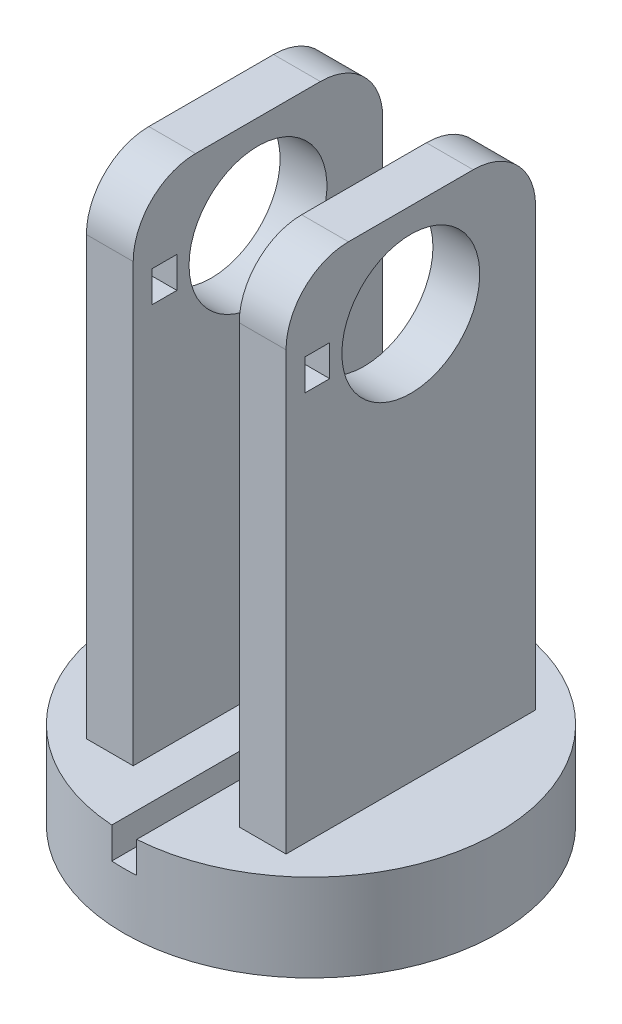
ISO-10303-21;
HEADER;
FILE_DESCRIPTION(('STEP AP214'),'2;1');
FILE_NAME('part.step','',(''),(''),'','','');
FILE_SCHEMA(('AUTOMOTIVE_DESIGN { 1 0 10303 214 1 1 1 1 }'));
ENDSEC;
DATA;
#1=APPLICATION_CONTEXT('core data for automotive mechanical design processes');
#2=APPLICATION_PROTOCOL_DEFINITION('international standard','automotive_design',2000,#1);
#3=PRODUCT_CONTEXT('',#1,'mechanical');
#4=PRODUCT('Part','Part','',(#3));
#5=PRODUCT_RELATED_PRODUCT_CATEGORY('part','',(#4));
#6=PRODUCT_DEFINITION_FORMATION('','',#4);
#7=PRODUCT_DEFINITION_CONTEXT('part definition',#1,'design');
#8=PRODUCT_DEFINITION('design','',#6,#7);
#9=PRODUCT_DEFINITION_SHAPE('','',#8);
#10=(LENGTH_UNIT() NAMED_UNIT(*) SI_UNIT(.MILLI.,.METRE.));
#11=(NAMED_UNIT(*) PLANE_ANGLE_UNIT() SI_UNIT($,.RADIAN.));
#12=(NAMED_UNIT(*) SI_UNIT($,.STERADIAN.) SOLID_ANGLE_UNIT());
#13=UNCERTAINTY_MEASURE_WITH_UNIT(LENGTH_MEASURE(1.E-05),#10,'distance_accuracy_value','');
#14=(GEOMETRIC_REPRESENTATION_CONTEXT(3) GLOBAL_UNCERTAINTY_ASSIGNED_CONTEXT((#13)) GLOBAL_UNIT_ASSIGNED_CONTEXT((#10,
#11,#12)) REPRESENTATION_CONTEXT('',''));
#15=CARTESIAN_POINT('',(0.,0.,0.));
#16=DIRECTION('',(0.,0.,1.));
#17=DIRECTION('',(1.,0.,0.));
#18=AXIS2_PLACEMENT_3D('',#15,#16,#17);
#19=CARTESIAN_POINT('',(0.,14.,0.));
#20=DIRECTION('',(0.,1.,0.));
#21=DIRECTION('',(0.,0.,1.));
#22=AXIS2_PLACEMENT_3D('',#19,#20,#21);
#23=PLANE('',#22);
#24=DIRECTION('',(0.,0.,-1.));
#25=VECTOR('',#24,1.);
#26=CARTESIAN_POINT('',(2.,14.,-29.9332590941915));
#27=LINE('',#26,#25);
#28=CARTESIAN_POINT('',(2.,14.,29.9332590941915));
#29=VERTEX_POINT('',#28);
#30=CARTESIAN_POINT('',(2.,14.,-29.9332590941915));
#31=VERTEX_POINT('',#30);
#32=EDGE_CURVE('E245',#29,#31,#27,.T.);
#33=ORIENTED_EDGE('',*,*,#32,.F.);
#34=CARTESIAN_POINT('',(0.,14.,0.));
#35=DIRECTION('',(0.,1.,0.));
#36=DIRECTION('',(0.,0.,1.));
#37=AXIS2_PLACEMENT_3D('',#34,#35,#36);
#38=CIRCLE('',#37,30.);
#39=EDGE_CURVE('E333',#29,#31,#38,.T.);
#40=ORIENTED_EDGE('',*,*,#39,.T.);
#41=EDGE_LOOP('',(#33,#40));
#42=FACE_BOUND('',#41,.T.);
#43=DIRECTION('',(0.,0.,-1.));
#44=VECTOR('',#43,1.);
#45=CARTESIAN_POINT('',(16.,14.,20.));
#46=LINE('',#45,#44);
#47=CARTESIAN_POINT('',(16.,14.,20.));
#48=VERTEX_POINT('',#47);
#49=CARTESIAN_POINT('',(16.,14.,-20.));
#50=VERTEX_POINT('',#49);
#51=EDGE_CURVE('E285',#48,#50,#46,.T.);
#52=ORIENTED_EDGE('',*,*,#51,.F.);
#53=DIRECTION('',(1.,0.,0.));
#54=VECTOR('',#53,1.);
#55=CARTESIAN_POINT('',(8.5,14.,20.));
#56=LINE('',#55,#54);
#57=CARTESIAN_POINT('',(8.5,14.,20.));
#58=VERTEX_POINT('',#57);
#59=EDGE_CURVE('E274',#58,#48,#56,.T.);
#60=ORIENTED_EDGE('',*,*,#59,.F.);
#61=DIRECTION('',(0.,0.,1.));
#62=VECTOR('',#61,1.);
#63=CARTESIAN_POINT('',(8.5,14.,-20.));
#64=LINE('',#63,#62);
#65=CARTESIAN_POINT('',(8.5,14.,-20.));
#66=VERTEX_POINT('',#65);
#67=EDGE_CURVE('E279',#66,#58,#64,.T.);
#68=ORIENTED_EDGE('',*,*,#67,.F.);
#69=DIRECTION('',(-1.,0.,0.));
#70=VECTOR('',#69,1.);
#71=CARTESIAN_POINT('',(16.,14.,-20.));
#72=LINE('',#71,#70);
#73=EDGE_CURVE('E288',#50,#66,#72,.T.);
#74=ORIENTED_EDGE('',*,*,#73,.F.);
#75=EDGE_LOOP('',(#52,#60,#68,#74));
#76=FACE_BOUND('',#75,.T.);
#77=ADVANCED_FACE('F32',(#42,#76),#23,.T.);
#78=DIRECTION('',(0.,0.,1.));
#79=VECTOR('',#78,1.);
#80=CARTESIAN_POINT('',(-2.,14.,-29.9332590941915));
#81=LINE('',#80,#79);
#82=CARTESIAN_POINT('',(-2.,14.,-29.9332590941915));
#83=VERTEX_POINT('',#82);
#84=CARTESIAN_POINT('',(-2.,14.,29.9332590941915));
#85=VERTEX_POINT('',#84);
#86=EDGE_CURVE('E240',#83,#85,#81,.T.);
#87=ORIENTED_EDGE('',*,*,#86,.F.);
#88=EDGE_CURVE('E337',#83,#85,#38,.T.);
#89=ORIENTED_EDGE('',*,*,#88,.T.);
#90=EDGE_LOOP('',(#87,#89));
#91=FACE_BOUND('',#90,.T.);
#92=DIRECTION('',(0.,0.,-1.));
#93=VECTOR('',#92,1.);
#94=CARTESIAN_POINT('',(-8.5,14.,20.));
#95=LINE('',#94,#93);
#96=CARTESIAN_POINT('',(-8.5,14.,20.));
#97=VERTEX_POINT('',#96);
#98=CARTESIAN_POINT('',(-8.5,14.,-20.));
#99=VERTEX_POINT('',#98);
#100=EDGE_CURVE('E311',#97,#99,#95,.T.);
#101=ORIENTED_EDGE('',*,*,#100,.F.);
#102=DIRECTION('',(1.,0.,0.));
#103=VECTOR('',#102,1.);
#104=CARTESIAN_POINT('',(-16.,14.,20.));
#105=LINE('',#104,#103);
#106=CARTESIAN_POINT('',(-16.,14.,20.));
#107=VERTEX_POINT('',#106);
#108=EDGE_CURVE('E300',#107,#97,#105,.T.);
#109=ORIENTED_EDGE('',*,*,#108,.F.);
#110=DIRECTION('',(0.,0.,1.));
#111=VECTOR('',#110,1.);
#112=CARTESIAN_POINT('',(-16.,14.,-20.));
#113=LINE('',#112,#111);
#114=CARTESIAN_POINT('',(-16.,14.,-20.));
#115=VERTEX_POINT('',#114);
#116=EDGE_CURVE('E305',#115,#107,#113,.T.);
#117=ORIENTED_EDGE('',*,*,#116,.F.);
#118=DIRECTION('',(-1.,0.,0.));
#119=VECTOR('',#118,1.);
#120=CARTESIAN_POINT('',(-8.5,14.,-20.));
#121=LINE('',#120,#119);
#122=EDGE_CURVE('E314',#99,#115,#121,.T.);
#123=ORIENTED_EDGE('',*,*,#122,.F.);
#124=EDGE_LOOP('',(#101,#109,#117,#123));
#125=FACE_BOUND('',#124,.T.);
#126=ADVANCED_FACE('F449',(#91,#125),#23,.T.);
#127=CARTESIAN_POINT('',(0.,14.,0.));
#128=DIRECTION('',(0.,-1.,0.));
#129=DIRECTION('',(0.,0.,-1.));
#130=AXIS2_PLACEMENT_3D('',#127,#128,#129);
#131=CYLINDRICAL_SURFACE('',#130,30.);
#132=CARTESIAN_POINT('',(0.,9.,0.));
#133=DIRECTION('',(0.,1.,0.));
#134=DIRECTION('',(0.,0.,1.));
#135=AXIS2_PLACEMENT_3D('',#132,#133,#134);
#136=CIRCLE('',#135,30.);
#137=CARTESIAN_POINT('',(2.,9.,-29.9332590941915));
#138=VERTEX_POINT('',#137);
#139=CARTESIAN_POINT('',(-2.,9.,-29.9332590941915));
#140=VERTEX_POINT('',#139);
#141=EDGE_CURVE('E241',#138,#140,#136,.T.);
#142=ORIENTED_EDGE('',*,*,#141,.F.);
#143=DIRECTION('',(0.,1.,0.));
#144=VECTOR('',#143,1.);
#145=CARTESIAN_POINT('',(2.,9.,-29.9332590941915));
#146=LINE('',#145,#144);
#147=EDGE_CURVE('E255',#138,#31,#146,.T.);
#148=ORIENTED_EDGE('',*,*,#147,.T.);
#149=ORIENTED_EDGE('',*,*,#39,.F.);
#150=DIRECTION('',(0.,1.,0.));
#151=VECTOR('',#150,1.);
#152=CARTESIAN_POINT('',(2.,9.,29.9332590941915));
#153=LINE('',#152,#151);
#154=CARTESIAN_POINT('',(2.,9.,29.9332590941915));
#155=VERTEX_POINT('',#154);
#156=EDGE_CURVE('E259',#155,#29,#153,.T.);
#157=ORIENTED_EDGE('',*,*,#156,.F.);
#158=CARTESIAN_POINT('',(0.,9.,0.));
#159=DIRECTION('',(0.,1.,0.));
#160=DIRECTION('',(0.,0.,1.));
#161=AXIS2_PLACEMENT_3D('',#158,#159,#160);
#162=CIRCLE('',#161,30.);
#163=CARTESIAN_POINT('',(-2.,9.,29.9332590941915));
#164=VERTEX_POINT('',#163);
#165=EDGE_CURVE('E247',#164,#155,#162,.T.);
#166=ORIENTED_EDGE('',*,*,#165,.F.);
#167=DIRECTION('',(0.,1.,0.));
#168=VECTOR('',#167,1.);
#169=CARTESIAN_POINT('',(-2.,9.,29.9332590941915));
#170=LINE('',#169,#168);
#171=EDGE_CURVE('E261',#164,#85,#170,.T.);
#172=ORIENTED_EDGE('',*,*,#171,.T.);
#173=ORIENTED_EDGE('',*,*,#88,.F.);
#174=DIRECTION('',(0.,1.,0.));
#175=VECTOR('',#174,1.);
#176=CARTESIAN_POINT('',(-2.,9.,-29.9332590941915));
#177=LINE('',#176,#175);
#178=EDGE_CURVE('E252',#140,#83,#177,.T.);
#179=ORIENTED_EDGE('',*,*,#178,.F.);
#180=EDGE_LOOP('',(#142,#148,#149,#157,#166,#172,#173,#179));
#181=FACE_BOUND('',#180,.T.);
#182=CARTESIAN_POINT('',(0.,0.,0.));
#183=DIRECTION('',(0.,1.,0.));
#184=DIRECTION('',(0.,0.,1.));
#185=AXIS2_PLACEMENT_3D('',#182,#183,#184);
#186=CIRCLE('',#185,30.);
#187=CARTESIAN_POINT('',(0.,0.,30.));
#188=VERTEX_POINT('',#187);
#189=EDGE_CURVE('E330',#188,#188,#186,.T.);
#190=ORIENTED_EDGE('',*,*,#189,.T.);
#191=EDGE_LOOP('',(#190));
#192=FACE_BOUND('',#191,.T.);
#193=ADVANCED_FACE('F455',(#181,#192),#131,.T.);
#194=CARTESIAN_POINT('',(0.,0.,0.));
#195=DIRECTION('',(0.,1.,0.));
#196=DIRECTION('',(0.,0.,1.));
#197=AXIS2_PLACEMENT_3D('',#194,#195,#196);
#198=PLANE('',#197);
#199=CARTESIAN_POINT('',(0.,0.,0.));
#200=DIRECTION('',(0.,-1.,0.));
#201=DIRECTION('',(0.,0.,-1.));
#202=AXIS2_PLACEMENT_3D('',#199,#200,#201);
#203=CIRCLE('',#202,11.05);
#204=CARTESIAN_POINT('',(0.,0.,-11.05));
#205=VERTEX_POINT('',#204);
#206=EDGE_CURVE('E326',#205,#205,#203,.T.);
#207=ORIENTED_EDGE('',*,*,#206,.F.);
#208=EDGE_LOOP('',(#207));
#209=FACE_BOUND('',#208,.T.);
#210=ORIENTED_EDGE('',*,*,#189,.F.);
#211=EDGE_LOOP('',(#210));
#212=FACE_BOUND('',#211,.T.);
#213=ADVANCED_FACE('F462',(#209,#212),#198,.F.);
#214=CARTESIAN_POINT('',(0.,7.,0.));
#215=DIRECTION('',(0.,-1.,0.));
#216=DIRECTION('',(0.,0.,-1.));
#217=AXIS2_PLACEMENT_3D('',#214,#215,#216);
#218=CYLINDRICAL_SURFACE('',#217,11.05);
#219=CARTESIAN_POINT('',(0.,7.,0.));
#220=DIRECTION('',(0.,-1.,0.));
#221=DIRECTION('',(0.,0.,-1.));
#222=AXIS2_PLACEMENT_3D('',#219,#220,#221);
#223=CIRCLE('',#222,11.05);
#224=CARTESIAN_POINT('',(0.,7.,-11.05));
#225=VERTEX_POINT('',#224);
#226=EDGE_CURVE('E327',#225,#225,#223,.T.);
#227=CARTESIAN_POINT('',(0.,7.,-11.05));
#228=CARTESIAN_POINT('',(0.,6.92708333333333,-11.05));
#229=CARTESIAN_POINT('',(0.,6.85416666666667,-11.05));
#230=CARTESIAN_POINT('',(0.,6.70833333333333,-11.05));
#231=CARTESIAN_POINT('',(0.,6.63541666666667,-11.05));
#232=CARTESIAN_POINT('',(0.,6.48958333333333,-11.05));
#233=CARTESIAN_POINT('',(0.,6.41666666666667,-11.05));
#234=CARTESIAN_POINT('',(0.,6.27083333333333,-11.05));
#235=CARTESIAN_POINT('',(0.,6.19791666666667,-11.05));
#236=CARTESIAN_POINT('',(0.,6.05208333333333,-11.05));
#237=CARTESIAN_POINT('',(0.,5.97916666666667,-11.05));
#238=CARTESIAN_POINT('',(0.,5.83333333333333,-11.05));
#239=CARTESIAN_POINT('',(0.,5.76041666666667,-11.05));
#240=CARTESIAN_POINT('',(0.,5.61458333333333,-11.05));
#241=CARTESIAN_POINT('',(0.,5.54166666666667,-11.05));
#242=CARTESIAN_POINT('',(0.,5.39583333333333,-11.05));
#243=CARTESIAN_POINT('',(0.,5.32291666666667,-11.05));
#244=CARTESIAN_POINT('',(0.,5.17708333333333,-11.05));
#245=CARTESIAN_POINT('',(0.,5.10416666666667,-11.05));
#246=CARTESIAN_POINT('',(0.,4.95833333333333,-11.05));
#247=CARTESIAN_POINT('',(0.,4.88541666666667,-11.05));
#248=CARTESIAN_POINT('',(0.,4.73958333333333,-11.05));
#249=CARTESIAN_POINT('',(0.,4.66666666666667,-11.05));
#250=CARTESIAN_POINT('',(0.,4.52083333333333,-11.05));
#251=CARTESIAN_POINT('',(0.,4.44791666666667,-11.05));
#252=CARTESIAN_POINT('',(0.,4.30208333333333,-11.05));
#253=CARTESIAN_POINT('',(0.,4.22916666666667,-11.05));
#254=CARTESIAN_POINT('',(0.,4.08333333333333,-11.05));
#255=CARTESIAN_POINT('',(0.,4.01041666666667,-11.05));
#256=CARTESIAN_POINT('',(0.,3.86458333333333,-11.05));
#257=CARTESIAN_POINT('',(0.,3.79166666666667,-11.05));
#258=CARTESIAN_POINT('',(0.,3.64583333333333,-11.05));
#259=CARTESIAN_POINT('',(0.,3.57291666666667,-11.05));
#260=CARTESIAN_POINT('',(0.,3.42708333333333,-11.05));
#261=CARTESIAN_POINT('',(0.,3.35416666666667,-11.05));
#262=CARTESIAN_POINT('',(0.,3.20833333333333,-11.05));
#263=CARTESIAN_POINT('',(0.,3.13541666666667,-11.05));
#264=CARTESIAN_POINT('',(0.,2.98958333333333,-11.05));
#265=CARTESIAN_POINT('',(0.,2.91666666666667,-11.05));
#266=CARTESIAN_POINT('',(0.,2.77083333333333,-11.05));
#267=CARTESIAN_POINT('',(0.,2.69791666666667,-11.05));
#268=CARTESIAN_POINT('',(0.,2.55208333333333,-11.05));
#269=CARTESIAN_POINT('',(0.,2.47916666666667,-11.05));
#270=CARTESIAN_POINT('',(0.,2.33333333333333,-11.05));
#271=CARTESIAN_POINT('',(0.,2.26041666666667,-11.05));
#272=CARTESIAN_POINT('',(0.,2.11458333333333,-11.05));
#273=CARTESIAN_POINT('',(0.,2.04166666666667,-11.05));
#274=CARTESIAN_POINT('',(0.,1.89583333333333,-11.05));
#275=CARTESIAN_POINT('',(0.,1.82291666666667,-11.05));
#276=CARTESIAN_POINT('',(0.,1.67708333333333,-11.05));
#277=CARTESIAN_POINT('',(0.,1.60416666666667,-11.05));
#278=CARTESIAN_POINT('',(0.,1.45833333333333,-11.05));
#279=CARTESIAN_POINT('',(0.,1.38541666666667,-11.05));
#280=CARTESIAN_POINT('',(0.,1.23958333333333,-11.05));
#281=CARTESIAN_POINT('',(0.,1.16666666666667,-11.05));
#282=CARTESIAN_POINT('',(0.,1.02083333333333,-11.05));
#283=CARTESIAN_POINT('',(0.,0.947916666666668,-11.05));
#284=CARTESIAN_POINT('',(0.,0.802083333333334,-11.05));
#285=CARTESIAN_POINT('',(0.,0.729166666666667,-11.05));
#286=CARTESIAN_POINT('',(0.,0.583333333333334,-11.05));
#287=CARTESIAN_POINT('',(0.,0.510416666666668,-11.05));
#288=CARTESIAN_POINT('',(0.,0.364583333333335,-11.05));
#289=CARTESIAN_POINT('',(0.,0.291666666666668,-11.05));
#290=CARTESIAN_POINT('',(0.,0.145833333333334,-11.05));
#291=CARTESIAN_POINT('',(0.,0.0729166666666675,-11.05));
#292=CARTESIAN_POINT('',(0.,0.,-11.05));
#293=B_SPLINE_CURVE_WITH_KNOTS('',3,(#227,#228,#229,#230,#231,#232,#233,#234,#235,#236,#237,
#238,#239,#240,#241,#242,#243,#244,#245,#246,#247,#248,#249,#250,#251,#252,#253,#254,#255,#256,
#257,#258,#259,#260,#261,#262,#263,#264,#265,#266,#267,#268,#269,#270,#271,#272,#273,#274,#275,
#276,#277,#278,#279,#280,#281,#282,#283,#284,#285,#286,#287,#288,#289,#290,#291,#292),
.UNSPECIFIED.,.F.,.F.,(4,2,2,2,2,2,2,2,2,2,2,2,2,2,2,2,2,2,2,2,2,2,2,2,2,2,2,2,2,2,2,2,4),(0.,
0.21875,0.4375,0.656250000000001,0.875,1.09375,1.3125,1.53125,1.75,1.96875,2.1875,2.40625,2.625,
2.84375,3.0625,3.28125,3.5,3.71875,3.9375,4.15625,4.375,4.59375,4.8125,5.03125,5.25,5.46875,
5.6875,5.90625,6.125,6.34375,6.5625,6.78125,7.),.UNSPECIFIED.);
#294=EDGE_CURVE('BSEAM460',#225,#205,#293,.T.);
#295=ORIENTED_EDGE('',*,*,#226,.F.);
#296=ORIENTED_EDGE('',*,*,#206,.T.);
#297=ORIENTED_EDGE('',*,*,#294,.T.);
#298=ORIENTED_EDGE('',*,*,#294,.F.);
#299=EDGE_LOOP('',(#295,#297,#296,#298));
#300=FACE_BOUND('',#299,.T.);
#301=ADVANCED_FACE('F460',(#300),#218,.F.);
#302=CARTESIAN_POINT('',(0.,7.,0.));
#303=DIRECTION('',(0.,-1.,0.));
#304=DIRECTION('',(0.,0.,-1.));
#305=AXIS2_PLACEMENT_3D('',#302,#303,#304);
#306=PLANE('',#305);
#307=ORIENTED_EDGE('',*,*,#226,.T.);
#308=EDGE_LOOP('',(#307));
#309=FACE_BOUND('',#308,.T.);
#310=ADVANCED_FACE('F520',(#309),#306,.T.);
#311=CARTESIAN_POINT('',(-16.,94.,20.));
#312=DIRECTION('',(0.,0.,-1.));
#313=DIRECTION('',(-1.,0.,0.));
#314=AXIS2_PLACEMENT_3D('',#311,#312,#313);
#315=PLANE('',#314);
#316=DIRECTION('',(0.,-1.,0.));
#317=VECTOR('',#316,1.);
#318=CARTESIAN_POINT('',(-8.5,94.,20.));
#319=LINE('',#318,#317);
#320=CARTESIAN_POINT('',(-8.5,84.,20.));
#321=VERTEX_POINT('',#320);
#322=EDGE_CURVE('E324',#321,#97,#319,.T.);
#323=ORIENTED_EDGE('',*,*,#322,.F.);
#324=DIRECTION('',(1.,0.,0.));
#325=VECTOR('',#324,1.);
#326=CARTESIAN_POINT('',(-16.,84.,20.));
#327=LINE('',#326,#325);
#328=CARTESIAN_POINT('',(-16.,84.,20.));
#329=VERTEX_POINT('',#328);
#330=EDGE_CURVE('E373',#321,#329,#327,.F.);
#331=ORIENTED_EDGE('',*,*,#330,.T.);
#332=DIRECTION('',(0.,-1.,0.));
#333=VECTOR('',#332,1.);
#334=CARTESIAN_POINT('',(-16.,94.,20.));
#335=LINE('',#334,#333);
#336=EDGE_CURVE('E308',#329,#107,#335,.T.);
#337=ORIENTED_EDGE('',*,*,#336,.T.);
#338=ORIENTED_EDGE('',*,*,#108,.T.);
#339=EDGE_LOOP('',(#323,#331,#337,#338));
#340=FACE_BOUND('',#339,.T.);
#341=ADVANCED_FACE('F509',(#340),#315,.F.);
#342=CARTESIAN_POINT('',(-8.5,94.,20.));
#343=DIRECTION('',(-1.,0.,0.));
#344=DIRECTION('',(0.,0.,1.));
#345=AXIS2_PLACEMENT_3D('',#342,#343,#344);
#346=PLANE('',#345);
#347=DIRECTION('',(0.,0.,-1.));
#348=VECTOR('',#347,1.);
#349=CARTESIAN_POINT('',(-8.5,76.5,20.));
#350=LINE('',#349,#348);
#351=CARTESIAN_POINT('',(-8.5,76.5,17.));
#352=VERTEX_POINT('',#351);
#353=CARTESIAN_POINT('',(-8.5,76.5,13.));
#354=VERTEX_POINT('',#353);
#355=EDGE_CURVE('E235',#352,#354,#350,.T.);
#356=ORIENTED_EDGE('',*,*,#355,.F.);
#357=DIRECTION('',(0.,1.,0.));
#358=VECTOR('',#357,1.);
#359=CARTESIAN_POINT('',(-8.5,94.,17.));
#360=LINE('',#359,#358);
#361=CARTESIAN_POINT('',(-8.5,81.5,17.));
#362=VERTEX_POINT('',#361);
#363=EDGE_CURVE('E237',#352,#362,#360,.T.);
#364=ORIENTED_EDGE('',*,*,#363,.T.);
#365=DIRECTION('',(0.,0.,-1.));
#366=VECTOR('',#365,1.);
#367=CARTESIAN_POINT('',(-8.5,81.5,20.));
#368=LINE('',#367,#366);
#369=CARTESIAN_POINT('',(-8.5,81.5,13.));
#370=VERTEX_POINT('',#369);
#371=EDGE_CURVE('E231',#362,#370,#368,.T.);
#372=ORIENTED_EDGE('',*,*,#371,.T.);
#373=DIRECTION('',(0.,1.,0.));
#374=VECTOR('',#373,1.);
#375=CARTESIAN_POINT('',(-8.5,94.,13.));
#376=LINE('',#375,#374);
#377=EDGE_CURVE('E199',#354,#370,#376,.T.);
#378=ORIENTED_EDGE('',*,*,#377,.F.);
#379=EDGE_LOOP('',(#356,#364,#372,#378));
#380=FACE_BOUND('',#379,.T.);
#381=CARTESIAN_POINT('',(-8.5,79.,0.));
#382=DIRECTION('',(-1.,0.,0.));
#383=DIRECTION('',(0.,0.,1.));
#384=AXIS2_PLACEMENT_3D('',#381,#382,#383);
#385=CIRCLE('',#384,11.05);
#386=CARTESIAN_POINT('',(-8.5,79.,11.05));
#387=VERTEX_POINT('',#386);
#388=EDGE_CURVE('E271',#387,#387,#385,.T.);
#389=ORIENTED_EDGE('',*,*,#388,.T.);
#390=EDGE_LOOP('',(#389));
#391=FACE_BOUND('',#390,.T.);
#392=DIRECTION('',(0.,-1.,0.));
#393=VECTOR('',#392,1.);
#394=CARTESIAN_POINT('',(-8.5,94.,-20.));
#395=LINE('',#394,#393);
#396=CARTESIAN_POINT('',(-8.5,84.,-20.));
#397=VERTEX_POINT('',#396);
#398=EDGE_CURVE('E322',#397,#99,#395,.T.);
#399=ORIENTED_EDGE('',*,*,#398,.F.);
#400=CARTESIAN_POINT('',(-8.5,84.,-10.));
#401=DIRECTION('',(-1.,0.,0.));
#402=DIRECTION('',(0.,0.,1.));
#403=AXIS2_PLACEMENT_3D('',#400,#401,#402);
#404=CIRCLE('',#403,10.);
#405=CARTESIAN_POINT('',(-8.5,94.,-10.));
#406=VERTEX_POINT('',#405);
#407=EDGE_CURVE('E353',#397,#406,#404,.F.);
#408=ORIENTED_EDGE('',*,*,#407,.T.);
#409=DIRECTION('',(0.,0.,-1.));
#410=VECTOR('',#409,1.);
#411=CARTESIAN_POINT('',(-8.5,94.,20.));
#412=LINE('',#411,#410);
#413=CARTESIAN_POINT('',(-8.5,94.,10.));
#414=VERTEX_POINT('',#413);
#415=EDGE_CURVE('E301',#414,#406,#412,.T.);
#416=ORIENTED_EDGE('',*,*,#415,.F.);
#417=CARTESIAN_POINT('',(-8.5,84.,10.));
#418=DIRECTION('',(-1.,0.,0.));
#419=DIRECTION('',(0.,0.,1.));
#420=AXIS2_PLACEMENT_3D('',#417,#418,#419);
#421=CIRCLE('',#420,10.);
#422=EDGE_CURVE('E351',#414,#321,#421,.F.);
#423=ORIENTED_EDGE('',*,*,#422,.T.);
#424=ORIENTED_EDGE('',*,*,#322,.T.);
#425=ORIENTED_EDGE('',*,*,#100,.T.);
#426=EDGE_LOOP('',(#399,#408,#416,#423,#424,#425));
#427=FACE_BOUND('',#426,.T.);
#428=ADVANCED_FACE('F511',(#380,#391,#427),#346,.F.);
#429=CARTESIAN_POINT('',(-8.5,94.,-20.));
#430=DIRECTION('',(0.,0.,1.));
#431=DIRECTION('',(1.,0.,0.));
#432=AXIS2_PLACEMENT_3D('',#429,#430,#431);
#433=PLANE('',#432);
#434=DIRECTION('',(0.,-1.,0.));
#435=VECTOR('',#434,1.);
#436=CARTESIAN_POINT('',(-16.,94.,-20.));
#437=LINE('',#436,#435);
#438=CARTESIAN_POINT('',(-16.,84.,-20.));
#439=VERTEX_POINT('',#438);
#440=EDGE_CURVE('E320',#439,#115,#437,.T.);
#441=ORIENTED_EDGE('',*,*,#440,.F.);
#442=DIRECTION('',(-1.,0.,0.));
#443=VECTOR('',#442,1.);
#444=CARTESIAN_POINT('',(-8.5,84.,-20.));
#445=LINE('',#444,#443);
#446=EDGE_CURVE('E349',#439,#397,#445,.F.);
#447=ORIENTED_EDGE('',*,*,#446,.T.);
#448=ORIENTED_EDGE('',*,*,#398,.T.);
#449=ORIENTED_EDGE('',*,*,#122,.T.);
#450=EDGE_LOOP('',(#441,#447,#448,#449));
#451=FACE_BOUND('',#450,.T.);
#452=ADVANCED_FACE('F500',(#451),#433,.F.);
#453=CARTESIAN_POINT('',(-16.,94.,-20.));
#454=DIRECTION('',(1.,0.,0.));
#455=DIRECTION('',(0.,0.,-1.));
#456=AXIS2_PLACEMENT_3D('',#453,#454,#455);
#457=PLANE('',#456);
#458=DIRECTION('',(0.,0.,-1.));
#459=VECTOR('',#458,1.);
#460=CARTESIAN_POINT('',(-16.,81.5,17.));
#461=LINE('',#460,#459);
#462=CARTESIAN_POINT('',(-16.,81.5,17.));
#463=VERTEX_POINT('',#462);
#464=CARTESIAN_POINT('',(-16.,81.5,13.));
#465=VERTEX_POINT('',#464);
#466=EDGE_CURVE('E205',#463,#465,#461,.T.);
#467=ORIENTED_EDGE('',*,*,#466,.F.);
#468=DIRECTION('',(0.,1.,0.));
#469=VECTOR('',#468,1.);
#470=CARTESIAN_POINT('',(-16.,76.5,17.));
#471=LINE('',#470,#469);
#472=CARTESIAN_POINT('',(-16.,76.5,17.));
#473=VERTEX_POINT('',#472);
#474=EDGE_CURVE('E55',#473,#463,#471,.T.);
#475=ORIENTED_EDGE('',*,*,#474,.F.);
#476=DIRECTION('',(0.,0.,-1.));
#477=VECTOR('',#476,1.);
#478=CARTESIAN_POINT('',(-16.,76.5,17.));
#479=LINE('',#478,#477);
#480=CARTESIAN_POINT('',(-16.,76.5,13.));
#481=VERTEX_POINT('',#480);
#482=EDGE_CURVE('E213',#473,#481,#479,.T.);
#483=ORIENTED_EDGE('',*,*,#482,.T.);
#484=DIRECTION('',(0.,1.,0.));
#485=VECTOR('',#484,1.);
#486=CARTESIAN_POINT('',(-16.,76.5,13.));
#487=LINE('',#486,#485);
#488=EDGE_CURVE('E196',#481,#465,#487,.T.);
#489=ORIENTED_EDGE('',*,*,#488,.T.);
#490=EDGE_LOOP('',(#467,#475,#483,#489));
#491=FACE_BOUND('',#490,.T.);
#492=CARTESIAN_POINT('',(-16.,79.,0.));
#493=DIRECTION('',(1.,0.,0.));
#494=DIRECTION('',(0.,0.,-1.));
#495=AXIS2_PLACEMENT_3D('',#492,#493,#494);
#496=CIRCLE('',#495,11.05);
#497=CARTESIAN_POINT('',(-16.,79.,-11.05));
#498=VERTEX_POINT('',#497);
#499=EDGE_CURVE('E268',#498,#498,#496,.T.);
#500=ORIENTED_EDGE('',*,*,#499,.T.);
#501=EDGE_LOOP('',(#500));
#502=FACE_BOUND('',#501,.T.);
#503=DIRECTION('',(0.,0.,1.));
#504=VECTOR('',#503,1.);
#505=CARTESIAN_POINT('',(-16.,94.,-20.));
#506=LINE('',#505,#504);
#507=CARTESIAN_POINT('',(-16.,94.,-10.));
#508=VERTEX_POINT('',#507);
#509=CARTESIAN_POINT('',(-16.,94.,10.));
#510=VERTEX_POINT('',#509);
#511=EDGE_CURVE('E304',#508,#510,#506,.T.);
#512=ORIENTED_EDGE('',*,*,#511,.F.);
#513=CARTESIAN_POINT('',(-16.,84.,-10.));
#514=DIRECTION('',(1.,0.,0.));
#515=DIRECTION('',(0.,0.,-1.));
#516=AXIS2_PLACEMENT_3D('',#513,#514,#515);
#517=CIRCLE('',#516,10.);
#518=EDGE_CURVE('E347',#508,#439,#517,.F.);
#519=ORIENTED_EDGE('',*,*,#518,.T.);
#520=ORIENTED_EDGE('',*,*,#440,.T.);
#521=ORIENTED_EDGE('',*,*,#116,.T.);
#522=ORIENTED_EDGE('',*,*,#336,.F.);
#523=CARTESIAN_POINT('',(-16.,84.,10.));
#524=DIRECTION('',(1.,0.,0.));
#525=DIRECTION('',(0.,0.,-1.));
#526=AXIS2_PLACEMENT_3D('',#523,#524,#525);
#527=CIRCLE('',#526,10.);
#528=EDGE_CURVE('E345',#329,#510,#527,.F.);
#529=ORIENTED_EDGE('',*,*,#528,.T.);
#530=EDGE_LOOP('',(#512,#519,#520,#521,#522,#529));
#531=FACE_BOUND('',#530,.T.);
#532=ADVANCED_FACE('F210',(#491,#502,#531),#457,.F.);
#533=CARTESIAN_POINT('',(0.,94.,0.));
#534=DIRECTION('',(0.,1.,0.));
#535=DIRECTION('',(0.,0.,1.));
#536=AXIS2_PLACEMENT_3D('',#533,#534,#535);
#537=PLANE('',#536);
#538=ORIENTED_EDGE('',*,*,#415,.T.);
#539=DIRECTION('',(-1.,0.,0.));
#540=VECTOR('',#539,1.);
#541=CARTESIAN_POINT('',(-16.,94.,-10.));
#542=LINE('',#541,#540);
#543=EDGE_CURVE('E342',#406,#508,#542,.T.);
#544=ORIENTED_EDGE('',*,*,#543,.T.);
#545=ORIENTED_EDGE('',*,*,#511,.T.);
#546=DIRECTION('',(1.,0.,0.));
#547=VECTOR('',#546,1.);
#548=CARTESIAN_POINT('',(-8.50000000000001,94.,10.));
#549=LINE('',#548,#547);
#550=EDGE_CURVE('E336',#510,#414,#549,.T.);
#551=ORIENTED_EDGE('',*,*,#550,.T.);
#552=EDGE_LOOP('',(#538,#544,#545,#551));
#553=FACE_BOUND('',#552,.T.);
#554=ADVANCED_FACE('F493',(#553),#537,.T.);
#555=CARTESIAN_POINT('',(8.5,94.,20.));
#556=DIRECTION('',(0.,0.,-1.));
#557=DIRECTION('',(-1.,0.,0.));
#558=AXIS2_PLACEMENT_3D('',#555,#556,#557);
#559=PLANE('',#558);
#560=DIRECTION('',(0.,-1.,0.));
#561=VECTOR('',#560,1.);
#562=CARTESIAN_POINT('',(16.,94.,20.));
#563=LINE('',#562,#561);
#564=CARTESIAN_POINT('',(16.,84.,20.));
#565=VERTEX_POINT('',#564);
#566=EDGE_CURVE('E298',#565,#48,#563,.T.);
#567=ORIENTED_EDGE('',*,*,#566,.F.);
#568=DIRECTION('',(1.,0.,0.));
#569=VECTOR('',#568,1.);
#570=CARTESIAN_POINT('',(8.5,84.,20.));
#571=LINE('',#570,#569);
#572=CARTESIAN_POINT('',(8.5,84.,20.));
#573=VERTEX_POINT('',#572);
#574=EDGE_CURVE('E371',#565,#573,#571,.F.);
#575=ORIENTED_EDGE('',*,*,#574,.T.);
#576=DIRECTION('',(0.,-1.,0.));
#577=VECTOR('',#576,1.);
#578=CARTESIAN_POINT('',(8.5,94.,20.));
#579=LINE('',#578,#577);
#580=EDGE_CURVE('E282',#573,#58,#579,.T.);
#581=ORIENTED_EDGE('',*,*,#580,.T.);
#582=ORIENTED_EDGE('',*,*,#59,.T.);
#583=EDGE_LOOP('',(#567,#575,#581,#582));
#584=FACE_BOUND('',#583,.T.);
#585=ADVANCED_FACE('F412',(#584),#559,.F.);
#586=CARTESIAN_POINT('',(16.,94.,20.));
#587=DIRECTION('',(-1.,0.,0.));
#588=DIRECTION('',(0.,0.,1.));
#589=AXIS2_PLACEMENT_3D('',#586,#587,#588);
#590=PLANE('',#589);
#591=DIRECTION('',(0.,0.,1.));
#592=VECTOR('',#591,1.);
#593=CARTESIAN_POINT('',(16.,76.5,17.));
#594=LINE('',#593,#592);
#595=CARTESIAN_POINT('',(16.,76.5,13.));
#596=VERTEX_POINT('',#595);
#597=CARTESIAN_POINT('',(16.,76.5,17.));
#598=VERTEX_POINT('',#597);
#599=EDGE_CURVE('E404',#596,#598,#594,.T.);
#600=ORIENTED_EDGE('',*,*,#599,.T.);
#601=DIRECTION('',(0.,-1.,0.));
#602=VECTOR('',#601,1.);
#603=CARTESIAN_POINT('',(16.,76.5,17.));
#604=LINE('',#603,#602);
#605=CARTESIAN_POINT('',(16.,81.5,17.));
#606=VERTEX_POINT('',#605);
#607=EDGE_CURVE('E232',#606,#598,#604,.T.);
#608=ORIENTED_EDGE('',*,*,#607,.F.);
#609=DIRECTION('',(0.,0.,1.));
#610=VECTOR('',#609,1.);
#611=CARTESIAN_POINT('',(16.,81.5,17.));
#612=LINE('',#611,#610);
#613=CARTESIAN_POINT('',(16.,81.5,13.));
#614=VERTEX_POINT('',#613);
#615=EDGE_CURVE('E229',#614,#606,#612,.T.);
#616=ORIENTED_EDGE('',*,*,#615,.F.);
#617=DIRECTION('',(0.,-1.,0.));
#618=VECTOR('',#617,1.);
#619=CARTESIAN_POINT('',(16.,76.5,13.));
#620=LINE('',#619,#618);
#621=EDGE_CURVE('E221',#614,#596,#620,.T.);
#622=ORIENTED_EDGE('',*,*,#621,.T.);
#623=EDGE_LOOP('',(#600,#608,#616,#622));
#624=FACE_BOUND('',#623,.T.);
#625=CARTESIAN_POINT('',(16.,79.,0.));
#626=DIRECTION('',(-1.,0.,0.));
#627=DIRECTION('',(0.,0.,1.));
#628=AXIS2_PLACEMENT_3D('',#625,#626,#627);
#629=CIRCLE('',#628,11.05);
#630=CARTESIAN_POINT('',(16.,79.,11.05));
#631=VERTEX_POINT('',#630);
#632=EDGE_CURVE('E265',#631,#631,#629,.T.);
#633=ORIENTED_EDGE('',*,*,#632,.T.);
#634=EDGE_LOOP('',(#633));
#635=FACE_BOUND('',#634,.T.);
#636=DIRECTION('',(0.,-1.,0.));
#637=VECTOR('',#636,1.);
#638=CARTESIAN_POINT('',(16.,94.,-20.));
#639=LINE('',#638,#637);
#640=CARTESIAN_POINT('',(16.,84.,-20.));
#641=VERTEX_POINT('',#640);
#642=EDGE_CURVE('E296',#641,#50,#639,.T.);
#643=ORIENTED_EDGE('',*,*,#642,.F.);
#644=CARTESIAN_POINT('',(16.,84.,-10.));
#645=DIRECTION('',(-1.,0.,0.));
#646=DIRECTION('',(0.,0.,1.));
#647=AXIS2_PLACEMENT_3D('',#644,#645,#646);
#648=CIRCLE('',#647,10.);
#649=CARTESIAN_POINT('',(16.,94.,-9.99999999999999));
#650=VERTEX_POINT('',#649);
#651=EDGE_CURVE('E369',#641,#650,#648,.F.);
#652=ORIENTED_EDGE('',*,*,#651,.T.);
#653=DIRECTION('',(0.,0.,-1.));
#654=VECTOR('',#653,1.);
#655=CARTESIAN_POINT('',(16.,94.,20.));
#656=LINE('',#655,#654);
#657=CARTESIAN_POINT('',(16.,94.,10.));
#658=VERTEX_POINT('',#657);
#659=EDGE_CURVE('E275',#658,#650,#656,.T.);
#660=ORIENTED_EDGE('',*,*,#659,.F.);
#661=CARTESIAN_POINT('',(16.,84.,10.));
#662=DIRECTION('',(-1.,0.,0.));
#663=DIRECTION('',(0.,0.,1.));
#664=AXIS2_PLACEMENT_3D('',#661,#662,#663);
#665=CIRCLE('',#664,10.);
#666=EDGE_CURVE('E367',#658,#565,#665,.F.);
#667=ORIENTED_EDGE('',*,*,#666,.T.);
#668=ORIENTED_EDGE('',*,*,#566,.T.);
#669=ORIENTED_EDGE('',*,*,#51,.T.);
#670=EDGE_LOOP('',(#643,#652,#660,#667,#668,#669));
#671=FACE_BOUND('',#670,.T.);
#672=ADVANCED_FACE('F406',(#624,#635,#671),#590,.F.);
#673=CARTESIAN_POINT('',(16.,94.,-20.));
#674=DIRECTION('',(0.,0.,1.));
#675=DIRECTION('',(1.,0.,0.));
#676=AXIS2_PLACEMENT_3D('',#673,#674,#675);
#677=PLANE('',#676);
#678=DIRECTION('',(0.,-1.,0.));
#679=VECTOR('',#678,1.);
#680=CARTESIAN_POINT('',(8.5,94.,-20.));
#681=LINE('',#680,#679);
#682=CARTESIAN_POINT('',(8.5,84.,-20.));
#683=VERTEX_POINT('',#682);
#684=EDGE_CURVE('E294',#683,#66,#681,.T.);
#685=ORIENTED_EDGE('',*,*,#684,.F.);
#686=DIRECTION('',(-1.,0.,0.));
#687=VECTOR('',#686,1.);
#688=CARTESIAN_POINT('',(16.,84.,-20.));
#689=LINE('',#688,#687);
#690=EDGE_CURVE('E365',#683,#641,#689,.F.);
#691=ORIENTED_EDGE('',*,*,#690,.T.);
#692=ORIENTED_EDGE('',*,*,#642,.T.);
#693=ORIENTED_EDGE('',*,*,#73,.T.);
#694=EDGE_LOOP('',(#685,#691,#692,#693));
#695=FACE_BOUND('',#694,.T.);
#696=ADVANCED_FACE('F411',(#695),#677,.F.);
#697=CARTESIAN_POINT('',(8.5,94.,-20.));
#698=DIRECTION('',(1.,0.,0.));
#699=DIRECTION('',(0.,0.,-1.));
#700=AXIS2_PLACEMENT_3D('',#697,#698,#699);
#701=PLANE('',#700);
#702=DIRECTION('',(0.,0.,1.));
#703=VECTOR('',#702,1.);
#704=CARTESIAN_POINT('',(8.5,81.5,-20.));
#705=LINE('',#704,#703);
#706=CARTESIAN_POINT('',(8.5,81.5,13.));
#707=VERTEX_POINT('',#706);
#708=CARTESIAN_POINT('',(8.5,81.5,17.));
#709=VERTEX_POINT('',#708);
#710=EDGE_CURVE('E375',#707,#709,#705,.T.);
#711=ORIENTED_EDGE('',*,*,#710,.T.);
#712=DIRECTION('',(0.,-1.,0.));
#713=VECTOR('',#712,1.);
#714=CARTESIAN_POINT('',(8.5,94.,17.));
#715=LINE('',#714,#713);
#716=CARTESIAN_POINT('',(8.5,76.5,17.));
#717=VERTEX_POINT('',#716);
#718=EDGE_CURVE('E11',#709,#717,#715,.T.);
#719=ORIENTED_EDGE('',*,*,#718,.T.);
#720=DIRECTION('',(0.,0.,1.));
#721=VECTOR('',#720,1.);
#722=CARTESIAN_POINT('',(8.5,76.5,-20.));
#723=LINE('',#722,#721);
#724=CARTESIAN_POINT('',(8.5,76.5,13.));
#725=VERTEX_POINT('',#724);
#726=EDGE_CURVE('E40',#725,#717,#723,.T.);
#727=ORIENTED_EDGE('',*,*,#726,.F.);
#728=DIRECTION('',(0.,-1.,0.));
#729=VECTOR('',#728,1.);
#730=CARTESIAN_POINT('',(8.5,94.,13.));
#731=LINE('',#730,#729);
#732=EDGE_CURVE('E380',#707,#725,#731,.T.);
#733=ORIENTED_EDGE('',*,*,#732,.F.);
#734=EDGE_LOOP('',(#711,#719,#727,#733));
#735=FACE_BOUND('',#734,.T.);
#736=CARTESIAN_POINT('',(8.5,79.,0.));
#737=DIRECTION('',(1.,0.,0.));
#738=DIRECTION('',(0.,0.,-1.));
#739=AXIS2_PLACEMENT_3D('',#736,#737,#738);
#740=CIRCLE('',#739,11.05);
#741=CARTESIAN_POINT('',(8.5,79.,-11.05));
#742=VERTEX_POINT('',#741);
#743=EDGE_CURVE('E258',#742,#742,#740,.T.);
#744=ORIENTED_EDGE('',*,*,#743,.T.);
#745=EDGE_LOOP('',(#744));
#746=FACE_BOUND('',#745,.T.);
#747=DIRECTION('',(0.,0.,1.));
#748=VECTOR('',#747,1.);
#749=CARTESIAN_POINT('',(8.5,94.,-20.));
#750=LINE('',#749,#748);
#751=CARTESIAN_POINT('',(8.5,94.,-10.));
#752=VERTEX_POINT('',#751);
#753=CARTESIAN_POINT('',(8.5,94.,10.));
#754=VERTEX_POINT('',#753);
#755=EDGE_CURVE('E278',#752,#754,#750,.T.);
#756=ORIENTED_EDGE('',*,*,#755,.F.);
#757=CARTESIAN_POINT('',(8.5,84.,-10.));
#758=DIRECTION('',(1.,0.,0.));
#759=DIRECTION('',(0.,0.,-1.));
#760=AXIS2_PLACEMENT_3D('',#757,#758,#759);
#761=CIRCLE('',#760,10.);
#762=EDGE_CURVE('E363',#752,#683,#761,.F.);
#763=ORIENTED_EDGE('',*,*,#762,.T.);
#764=ORIENTED_EDGE('',*,*,#684,.T.);
#765=ORIENTED_EDGE('',*,*,#67,.T.);
#766=ORIENTED_EDGE('',*,*,#580,.F.);
#767=CARTESIAN_POINT('',(8.5,84.,10.));
#768=DIRECTION('',(1.,0.,0.));
#769=DIRECTION('',(0.,0.,-1.));
#770=AXIS2_PLACEMENT_3D('',#767,#768,#769);
#771=CIRCLE('',#770,10.);
#772=EDGE_CURVE('E361',#573,#754,#771,.F.);
#773=ORIENTED_EDGE('',*,*,#772,.T.);
#774=EDGE_LOOP('',(#756,#763,#764,#765,#766,#773));
#775=FACE_BOUND('',#774,.T.);
#776=ADVANCED_FACE('F394',(#735,#746,#775),#701,.F.);
#777=CARTESIAN_POINT('',(0.,94.,0.));
#778=DIRECTION('',(0.,1.,0.));
#779=DIRECTION('',(0.,0.,1.));
#780=AXIS2_PLACEMENT_3D('',#777,#778,#779);
#781=PLANE('',#780);
#782=ORIENTED_EDGE('',*,*,#659,.T.);
#783=DIRECTION('',(-1.,0.,0.));
#784=VECTOR('',#783,1.);
#785=CARTESIAN_POINT('',(8.49999999999999,94.,-10.));
#786=LINE('',#785,#784);
#787=EDGE_CURVE('E358',#650,#752,#786,.T.);
#788=ORIENTED_EDGE('',*,*,#787,.T.);
#789=ORIENTED_EDGE('',*,*,#755,.T.);
#790=DIRECTION('',(1.,0.,0.));
#791=VECTOR('',#790,1.);
#792=CARTESIAN_POINT('',(16.,94.,10.));
#793=LINE('',#792,#791);
#794=EDGE_CURVE('E355',#754,#658,#793,.T.);
#795=ORIENTED_EDGE('',*,*,#794,.T.);
#796=EDGE_LOOP('',(#782,#788,#789,#795));
#797=FACE_BOUND('',#796,.T.);
#798=ADVANCED_FACE('F428',(#797),#781,.T.);
#799=CARTESIAN_POINT('',(0.,84.,-10.));
#800=DIRECTION('',(1.,0.,0.));
#801=DIRECTION('',(0.,0.,-1.));
#802=AXIS2_PLACEMENT_3D('',#799,#800,#801);
#803=CYLINDRICAL_SURFACE('',#802,10.);
#804=ORIENTED_EDGE('',*,*,#407,.F.);
#805=ORIENTED_EDGE('',*,*,#446,.F.);
#806=ORIENTED_EDGE('',*,*,#518,.F.);
#807=ORIENTED_EDGE('',*,*,#543,.F.);
#808=EDGE_LOOP('',(#804,#805,#806,#807));
#809=FACE_BOUND('',#808,.T.);
#810=ADVANCED_FACE('F469',(#809),#803,.T.);
#811=CARTESIAN_POINT('',(0.,84.,-10.));
#812=DIRECTION('',(1.,0.,0.));
#813=DIRECTION('',(0.,0.,-1.));
#814=AXIS2_PLACEMENT_3D('',#811,#812,#813);
#815=CYLINDRICAL_SURFACE('',#814,10.);
#816=ORIENTED_EDGE('',*,*,#651,.F.);
#817=ORIENTED_EDGE('',*,*,#690,.F.);
#818=ORIENTED_EDGE('',*,*,#762,.F.);
#819=ORIENTED_EDGE('',*,*,#787,.F.);
#820=EDGE_LOOP('',(#816,#817,#818,#819));
#821=FACE_BOUND('',#820,.T.);
#822=ADVANCED_FACE('F425',(#821),#815,.T.);
#823=CARTESIAN_POINT('',(0.,84.,10.));
#824=DIRECTION('',(-1.,0.,0.));
#825=DIRECTION('',(0.,0.,1.));
#826=AXIS2_PLACEMENT_3D('',#823,#824,#825);
#827=CYLINDRICAL_SURFACE('',#826,10.);
#828=ORIENTED_EDGE('',*,*,#772,.F.);
#829=ORIENTED_EDGE('',*,*,#574,.F.);
#830=ORIENTED_EDGE('',*,*,#666,.F.);
#831=ORIENTED_EDGE('',*,*,#794,.F.);
#832=EDGE_LOOP('',(#828,#829,#830,#831));
#833=FACE_BOUND('',#832,.T.);
#834=ADVANCED_FACE('F436',(#833),#827,.T.);
#835=CARTESIAN_POINT('',(0.,84.,10.));
#836=DIRECTION('',(-1.,0.,0.));
#837=DIRECTION('',(0.,0.,1.));
#838=AXIS2_PLACEMENT_3D('',#835,#836,#837);
#839=CYLINDRICAL_SURFACE('',#838,10.);
#840=ORIENTED_EDGE('',*,*,#528,.F.);
#841=ORIENTED_EDGE('',*,*,#330,.F.);
#842=ORIENTED_EDGE('',*,*,#422,.F.);
#843=ORIENTED_EDGE('',*,*,#550,.F.);
#844=EDGE_LOOP('',(#840,#841,#842,#843));
#845=FACE_BOUND('',#844,.T.);
#846=ADVANCED_FACE('F34',(#845),#839,.T.);
#847=CARTESIAN_POINT('',(30.,79.,0.));
#848=DIRECTION('',(-1.,0.,0.));
#849=DIRECTION('',(0.,0.,1.));
#850=AXIS2_PLACEMENT_3D('',#847,#848,#849);
#851=CYLINDRICAL_SURFACE('',#850,11.05);
#852=ORIENTED_EDGE('',*,*,#743,.F.);
#853=EDGE_LOOP('',(#852));
#854=FACE_BOUND('',#853,.T.);
#855=ORIENTED_EDGE('',*,*,#632,.F.);
#856=EDGE_LOOP('',(#855));
#857=FACE_BOUND('',#856,.T.);
#858=ADVANCED_FACE('F478',(#854,#857),#851,.F.);
#859=ORIENTED_EDGE('',*,*,#499,.F.);
#860=EDGE_LOOP('',(#859));
#861=FACE_BOUND('',#860,.T.);
#862=ORIENTED_EDGE('',*,*,#388,.F.);
#863=EDGE_LOOP('',(#862));
#864=FACE_BOUND('',#863,.T.);
#865=ADVANCED_FACE('F483',(#861,#864),#851,.F.);
#866=CARTESIAN_POINT('',(2.,9.,-29.9332590941915));
#867=DIRECTION('',(1.,0.,0.));
#868=DIRECTION('',(0.,0.,-1.));
#869=AXIS2_PLACEMENT_3D('',#866,#867,#868);
#870=PLANE('',#869);
#871=ORIENTED_EDGE('',*,*,#32,.T.);
#872=ORIENTED_EDGE('',*,*,#147,.F.);
#873=DIRECTION('',(0.,0.,-1.));
#874=VECTOR('',#873,1.);
#875=CARTESIAN_POINT('',(2.,9.,-29.9332590941915));
#876=LINE('',#875,#874);
#877=EDGE_CURVE('E249',#155,#138,#876,.T.);
#878=ORIENTED_EDGE('',*,*,#877,.F.);
#879=ORIENTED_EDGE('',*,*,#156,.T.);
#880=EDGE_LOOP('',(#871,#872,#878,#879));
#881=FACE_BOUND('',#880,.T.);
#882=ADVANCED_FACE('F568',(#881),#870,.F.);
#883=CARTESIAN_POINT('',(-2.,9.,-29.9332590941915));
#884=DIRECTION('',(-1.,0.,0.));
#885=DIRECTION('',(0.,0.,1.));
#886=AXIS2_PLACEMENT_3D('',#883,#884,#885);
#887=PLANE('',#886);
#888=ORIENTED_EDGE('',*,*,#86,.T.);
#889=ORIENTED_EDGE('',*,*,#171,.F.);
#890=DIRECTION('',(0.,0.,1.));
#891=VECTOR('',#890,1.);
#892=CARTESIAN_POINT('',(-2.,9.,-29.9332590941915));
#893=LINE('',#892,#891);
#894=EDGE_CURVE('E244',#140,#164,#893,.T.);
#895=ORIENTED_EDGE('',*,*,#894,.F.);
#896=ORIENTED_EDGE('',*,*,#178,.T.);
#897=EDGE_LOOP('',(#888,#889,#895,#896));
#898=FACE_BOUND('',#897,.T.);
#899=ADVANCED_FACE('F741',(#898),#887,.F.);
#900=CARTESIAN_POINT('',(0.,9.,0.));
#901=DIRECTION('',(0.,1.,0.));
#902=DIRECTION('',(0.,0.,1.));
#903=AXIS2_PLACEMENT_3D('',#900,#901,#902);
#904=PLANE('',#903);
#905=ORIENTED_EDGE('',*,*,#141,.T.);
#906=ORIENTED_EDGE('',*,*,#894,.T.);
#907=ORIENTED_EDGE('',*,*,#165,.T.);
#908=ORIENTED_EDGE('',*,*,#877,.T.);
#909=EDGE_LOOP('',(#905,#906,#907,#908));
#910=FACE_BOUND('',#909,.T.);
#911=ADVANCED_FACE('F657',(#910),#904,.T.);
#912=CARTESIAN_POINT('',(22.4031242374329,81.5,17.));
#913=DIRECTION('',(0.,1.,0.));
#914=DIRECTION('',(0.,0.,1.));
#915=AXIS2_PLACEMENT_3D('',#912,#913,#914);
#916=PLANE('',#915);
#917=DIRECTION('',(-1.,0.,0.));
#918=VECTOR('',#917,1.);
#919=CARTESIAN_POINT('',(22.4031242374329,81.5,13.));
#920=LINE('',#919,#918);
#921=EDGE_CURVE('E201',#614,#707,#920,.T.);
#922=ORIENTED_EDGE('',*,*,#921,.F.);
#923=ORIENTED_EDGE('',*,*,#615,.T.);
#924=DIRECTION('',(-1.,0.,0.));
#925=VECTOR('',#924,1.);
#926=CARTESIAN_POINT('',(22.4031242374329,81.5,17.));
#927=LINE('',#926,#925);
#928=EDGE_CURVE('E202',#606,#709,#927,.T.);
#929=ORIENTED_EDGE('',*,*,#928,.T.);
#930=ORIENTED_EDGE('',*,*,#710,.F.);
#931=EDGE_LOOP('',(#922,#923,#929,#930));
#932=FACE_BOUND('',#931,.T.);
#933=ADVANCED_FACE('F397',(#932),#916,.F.);
#934=CARTESIAN_POINT('',(22.4031242374329,76.5,13.));
#935=DIRECTION('',(0.,0.,1.));
#936=DIRECTION('',(1.,0.,0.));
#937=AXIS2_PLACEMENT_3D('',#934,#935,#936);
#938=PLANE('',#937);
#939=ORIENTED_EDGE('',*,*,#732,.T.);
#940=DIRECTION('',(-1.,0.,0.));
#941=VECTOR('',#940,1.);
#942=CARTESIAN_POINT('',(22.4031242374329,76.5,13.));
#943=LINE('',#942,#941);
#944=EDGE_CURVE('E223',#596,#725,#943,.T.);
#945=ORIENTED_EDGE('',*,*,#944,.F.);
#946=ORIENTED_EDGE('',*,*,#621,.F.);
#947=ORIENTED_EDGE('',*,*,#921,.T.);
#948=EDGE_LOOP('',(#939,#945,#946,#947));
#949=FACE_BOUND('',#948,.T.);
#950=ADVANCED_FACE('F400',(#949),#938,.T.);
#951=CARTESIAN_POINT('',(22.4031242374329,76.5,17.));
#952=DIRECTION('',(0.,1.,0.));
#953=DIRECTION('',(0.,0.,1.));
#954=AXIS2_PLACEMENT_3D('',#951,#952,#953);
#955=PLANE('',#954);
#956=ORIENTED_EDGE('',*,*,#726,.T.);
#957=DIRECTION('',(-1.,0.,0.));
#958=VECTOR('',#957,1.);
#959=CARTESIAN_POINT('',(22.4031242374329,76.5,17.));
#960=LINE('',#959,#958);
#961=EDGE_CURVE('E218',#598,#717,#960,.T.);
#962=ORIENTED_EDGE('',*,*,#961,.F.);
#963=ORIENTED_EDGE('',*,*,#599,.F.);
#964=ORIENTED_EDGE('',*,*,#944,.T.);
#965=EDGE_LOOP('',(#956,#962,#963,#964));
#966=FACE_BOUND('',#965,.T.);
#967=ADVANCED_FACE('F384',(#966),#955,.T.);
#968=CARTESIAN_POINT('',(22.4031242374329,76.5,17.));
#969=DIRECTION('',(0.,0.,1.));
#970=DIRECTION('',(1.,0.,0.));
#971=AXIS2_PLACEMENT_3D('',#968,#969,#970);
#972=PLANE('',#971);
#973=ORIENTED_EDGE('',*,*,#928,.F.);
#974=ORIENTED_EDGE('',*,*,#607,.T.);
#975=ORIENTED_EDGE('',*,*,#961,.T.);
#976=ORIENTED_EDGE('',*,*,#718,.F.);
#977=EDGE_LOOP('',(#973,#974,#975,#976));
#978=FACE_BOUND('',#977,.T.);
#979=ADVANCED_FACE('F392',(#978),#972,.F.);
#980=EDGE_CURVE('E222',#352,#473,#960,.T.);
#981=ORIENTED_EDGE('',*,*,#980,.T.);
#982=ORIENTED_EDGE('',*,*,#474,.T.);
#983=EDGE_CURVE('E207',#362,#463,#927,.T.);
#984=ORIENTED_EDGE('',*,*,#983,.F.);
#985=ORIENTED_EDGE('',*,*,#363,.F.);
#986=EDGE_LOOP('',(#981,#982,#984,#985));
#987=FACE_BOUND('',#986,.T.);
#988=ADVANCED_FACE('F706',(#987),#972,.F.);
#989=ORIENTED_EDGE('',*,*,#355,.T.);
#990=EDGE_CURVE('E225',#354,#481,#943,.T.);
#991=ORIENTED_EDGE('',*,*,#990,.T.);
#992=ORIENTED_EDGE('',*,*,#482,.F.);
#993=ORIENTED_EDGE('',*,*,#980,.F.);
#994=EDGE_LOOP('',(#989,#991,#992,#993));
#995=FACE_BOUND('',#994,.T.);
#996=ADVANCED_FACE('F698',(#995),#955,.T.);
#997=ORIENTED_EDGE('',*,*,#377,.T.);
#998=EDGE_CURVE('E47',#370,#465,#920,.T.);
#999=ORIENTED_EDGE('',*,*,#998,.T.);
#1000=ORIENTED_EDGE('',*,*,#488,.F.);
#1001=ORIENTED_EDGE('',*,*,#990,.F.);
#1002=EDGE_LOOP('',(#997,#999,#1000,#1001));
#1003=FACE_BOUND('',#1002,.T.);
#1004=ADVANCED_FACE('F193',(#1003),#938,.T.);
#1005=ORIENTED_EDGE('',*,*,#983,.T.);
#1006=ORIENTED_EDGE('',*,*,#466,.T.);
#1007=ORIENTED_EDGE('',*,*,#998,.F.);
#1008=ORIENTED_EDGE('',*,*,#371,.F.);
#1009=EDGE_LOOP('',(#1005,#1006,#1007,#1008));
#1010=FACE_BOUND('',#1009,.T.);
#1011=ADVANCED_FACE('F206',(#1010),#916,.F.);
#1012=CLOSED_SHELL('',(#77,#126,#193,#213,#301,#310,#341,#428,#452,#532,#554,#585,#672,#696,
#776,#798,#810,#822,#834,#846,#858,#865,#882,#899,#911,#933,#950,#967,#979,#988,#996,#1004,#1011));
#1013=MANIFOLD_SOLID_BREP('B2',#1012);
#1014=ADVANCED_BREP_SHAPE_REPRESENTATION('',(#18,#1013),#14);
#1015=SHAPE_DEFINITION_REPRESENTATION(#9,#1014);
ENDSEC;
END-ISO-10303-21;
